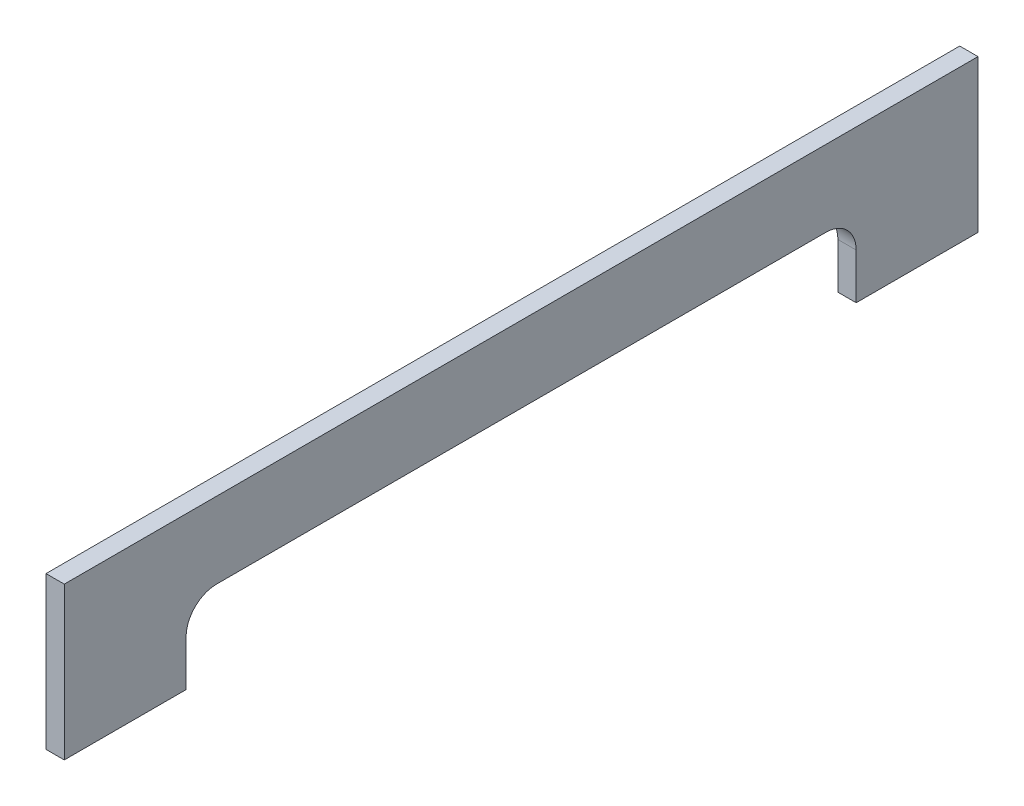
ISO-10303-21;
HEADER;
FILE_DESCRIPTION(('STEP AP214'),'2;1');
FILE_NAME('part.step','',(''),(''),'','','');
FILE_SCHEMA(('AUTOMOTIVE_DESIGN { 1 0 10303 214 1 1 1 1 }'));
ENDSEC;
DATA;
#1=APPLICATION_CONTEXT('core data for automotive mechanical design processes');
#2=APPLICATION_PROTOCOL_DEFINITION('international standard','automotive_design',2000,#1);
#3=PRODUCT_CONTEXT('',#1,'mechanical');
#4=PRODUCT('Part','Part','',(#3));
#5=PRODUCT_RELATED_PRODUCT_CATEGORY('part','',(#4));
#6=PRODUCT_DEFINITION_FORMATION('','',#4);
#7=PRODUCT_DEFINITION_CONTEXT('part definition',#1,'design');
#8=PRODUCT_DEFINITION('design','',#6,#7);
#9=PRODUCT_DEFINITION_SHAPE('','',#8);
#10=(LENGTH_UNIT() NAMED_UNIT(*) SI_UNIT(.MILLI.,.METRE.));
#11=(NAMED_UNIT(*) PLANE_ANGLE_UNIT() SI_UNIT($,.RADIAN.));
#12=(NAMED_UNIT(*) SI_UNIT($,.STERADIAN.) SOLID_ANGLE_UNIT());
#13=UNCERTAINTY_MEASURE_WITH_UNIT(LENGTH_MEASURE(1.E-05),#10,'distance_accuracy_value','');
#14=(GEOMETRIC_REPRESENTATION_CONTEXT(3) GLOBAL_UNCERTAINTY_ASSIGNED_CONTEXT((#13)) GLOBAL_UNIT_ASSIGNED_CONTEXT((#10,
#11,#12)) REPRESENTATION_CONTEXT('',''));
#15=CARTESIAN_POINT('',(0.,0.,0.));
#16=DIRECTION('',(0.,0.,1.));
#17=DIRECTION('',(1.,0.,0.));
#18=AXIS2_PLACEMENT_3D('',#15,#16,#17);
#19=CARTESIAN_POINT('',(6.,-25.,150.));
#20=DIRECTION('',(0.,1.,0.));
#21=DIRECTION('',(0.,0.,1.));
#22=AXIS2_PLACEMENT_3D('',#19,#20,#21);
#23=PLANE('',#22);
#24=DIRECTION('',(0.,0.,-1.));
#25=VECTOR('',#24,1.);
#26=CARTESIAN_POINT('',(0.,-25.,150.));
#27=LINE('',#26,#25);
#28=CARTESIAN_POINT('',(0.,-25.,150.));
#29=VERTEX_POINT('',#28);
#30=CARTESIAN_POINT('',(0.,-25.,110.));
#31=VERTEX_POINT('',#30);
#32=EDGE_CURVE('E122',#29,#31,#27,.T.);
#33=ORIENTED_EDGE('',*,*,#32,.T.);
#34=DIRECTION('',(1.,0.,0.));
#35=VECTOR('',#34,1.);
#36=CARTESIAN_POINT('',(-4.,-25.,110.));
#37=LINE('',#36,#35);
#38=CARTESIAN_POINT('',(6.,-25.,110.));
#39=VERTEX_POINT('',#38);
#40=EDGE_CURVE('E111',#31,#39,#37,.T.);
#41=ORIENTED_EDGE('',*,*,#40,.T.);
#42=DIRECTION('',(0.,0.,-1.));
#43=VECTOR('',#42,1.);
#44=CARTESIAN_POINT('',(6.,-25.,150.));
#45=LINE('',#44,#43);
#46=CARTESIAN_POINT('',(6.,-25.,150.));
#47=VERTEX_POINT('',#46);
#48=EDGE_CURVE('E120',#47,#39,#45,.T.);
#49=ORIENTED_EDGE('',*,*,#48,.F.);
#50=DIRECTION('',(-1.,0.,0.));
#51=VECTOR('',#50,1.);
#52=CARTESIAN_POINT('',(6.,-25.,150.));
#53=LINE('',#52,#51);
#54=EDGE_CURVE('E156',#47,#29,#53,.T.);
#55=ORIENTED_EDGE('',*,*,#54,.T.);
#56=EDGE_LOOP('',(#33,#41,#49,#55));
#57=FACE_BOUND('',#56,.T.);
#58=ADVANCED_FACE('F32',(#57),#23,.F.);
#59=CARTESIAN_POINT('',(6.,25.,150.));
#60=DIRECTION('',(0.,0.,-1.));
#61=DIRECTION('',(-1.,0.,0.));
#62=AXIS2_PLACEMENT_3D('',#59,#60,#61);
#63=PLANE('',#62);
#64=DIRECTION('',(0.,-1.,0.));
#65=VECTOR('',#64,1.);
#66=CARTESIAN_POINT('',(0.,25.,150.));
#67=LINE('',#66,#65);
#68=CARTESIAN_POINT('',(0.,25.,150.));
#69=VERTEX_POINT('',#68);
#70=EDGE_CURVE('E139',#69,#29,#67,.T.);
#71=ORIENTED_EDGE('',*,*,#70,.T.);
#72=ORIENTED_EDGE('',*,*,#54,.F.);
#73=DIRECTION('',(0.,-1.,0.));
#74=VECTOR('',#73,1.);
#75=CARTESIAN_POINT('',(6.,25.,150.));
#76=LINE('',#75,#74);
#77=CARTESIAN_POINT('',(6.,25.,150.));
#78=VERTEX_POINT('',#77);
#79=EDGE_CURVE('E128',#78,#47,#76,.T.);
#80=ORIENTED_EDGE('',*,*,#79,.F.);
#81=DIRECTION('',(-1.,0.,0.));
#82=VECTOR('',#81,1.);
#83=CARTESIAN_POINT('',(6.,25.,150.));
#84=LINE('',#83,#82);
#85=EDGE_CURVE('E138',#78,#69,#84,.T.);
#86=ORIENTED_EDGE('',*,*,#85,.T.);
#87=EDGE_LOOP('',(#71,#72,#80,#86));
#88=FACE_BOUND('',#87,.T.);
#89=ADVANCED_FACE('F191',(#88),#63,.F.);
#90=CARTESIAN_POINT('',(6.,-25.,-110.));
#91=VERTEX_POINT('',#90);
#92=CARTESIAN_POINT('',(6.,-25.,-150.));
#93=VERTEX_POINT('',#92);
#94=EDGE_CURVE('E131',#91,#93,#45,.T.);
#95=ORIENTED_EDGE('',*,*,#94,.F.);
#96=DIRECTION('',(1.,0.,0.));
#97=VECTOR('',#96,1.);
#98=CARTESIAN_POINT('',(-4.,-25.,-110.));
#99=LINE('',#98,#97);
#100=CARTESIAN_POINT('',(0.,-25.,-110.));
#101=VERTEX_POINT('',#100);
#102=EDGE_CURVE('E123',#101,#91,#99,.T.);
#103=ORIENTED_EDGE('',*,*,#102,.F.);
#104=CARTESIAN_POINT('',(0.,-25.,-150.));
#105=VERTEX_POINT('',#104);
#106=EDGE_CURVE('E142',#101,#105,#27,.T.);
#107=ORIENTED_EDGE('',*,*,#106,.T.);
#108=DIRECTION('',(-1.,0.,0.));
#109=VECTOR('',#108,1.);
#110=CARTESIAN_POINT('',(6.,-25.,-150.));
#111=LINE('',#110,#109);
#112=EDGE_CURVE('E153',#93,#105,#111,.T.);
#113=ORIENTED_EDGE('',*,*,#112,.F.);
#114=EDGE_LOOP('',(#95,#103,#107,#113));
#115=FACE_BOUND('',#114,.T.);
#116=ADVANCED_FACE('F193',(#115),#23,.F.);
#117=CARTESIAN_POINT('',(6.,25.,-150.));
#118=DIRECTION('',(0.,0.,1.));
#119=DIRECTION('',(1.,0.,0.));
#120=AXIS2_PLACEMENT_3D('',#117,#118,#119);
#121=PLANE('',#120);
#122=DIRECTION('',(0.,1.,0.));
#123=VECTOR('',#122,1.);
#124=CARTESIAN_POINT('',(0.,25.,-150.));
#125=LINE('',#124,#123);
#126=CARTESIAN_POINT('',(0.,25.,-150.));
#127=VERTEX_POINT('',#126);
#128=EDGE_CURVE('E144',#105,#127,#125,.T.);
#129=ORIENTED_EDGE('',*,*,#128,.T.);
#130=DIRECTION('',(-1.,0.,0.));
#131=VECTOR('',#130,1.);
#132=CARTESIAN_POINT('',(6.,25.,-150.));
#133=LINE('',#132,#131);
#134=CARTESIAN_POINT('',(6.,25.,-150.));
#135=VERTEX_POINT('',#134);
#136=EDGE_CURVE('E150',#135,#127,#133,.T.);
#137=ORIENTED_EDGE('',*,*,#136,.F.);
#138=DIRECTION('',(0.,1.,0.));
#139=VECTOR('',#138,1.);
#140=CARTESIAN_POINT('',(6.,25.,-150.));
#141=LINE('',#140,#139);
#142=EDGE_CURVE('E130',#93,#135,#141,.T.);
#143=ORIENTED_EDGE('',*,*,#142,.F.);
#144=ORIENTED_EDGE('',*,*,#112,.T.);
#145=EDGE_LOOP('',(#129,#137,#143,#144));
#146=FACE_BOUND('',#145,.T.);
#147=ADVANCED_FACE('F202',(#146),#121,.F.);
#148=CARTESIAN_POINT('',(6.,25.,150.));
#149=DIRECTION('',(0.,-1.,0.));
#150=DIRECTION('',(0.,0.,-1.));
#151=AXIS2_PLACEMENT_3D('',#148,#149,#150);
#152=PLANE('',#151);
#153=DIRECTION('',(0.,0.,1.));
#154=VECTOR('',#153,1.);
#155=CARTESIAN_POINT('',(0.,25.,150.));
#156=LINE('',#155,#154);
#157=EDGE_CURVE('E146',#127,#69,#156,.T.);
#158=ORIENTED_EDGE('',*,*,#157,.T.);
#159=ORIENTED_EDGE('',*,*,#85,.F.);
#160=DIRECTION('',(0.,0.,1.));
#161=VECTOR('',#160,1.);
#162=CARTESIAN_POINT('',(6.,25.,150.));
#163=LINE('',#162,#161);
#164=EDGE_CURVE('E133',#135,#78,#163,.T.);
#165=ORIENTED_EDGE('',*,*,#164,.F.);
#166=ORIENTED_EDGE('',*,*,#136,.T.);
#167=EDGE_LOOP('',(#158,#159,#165,#166));
#168=FACE_BOUND('',#167,.T.);
#169=ADVANCED_FACE('F208',(#168),#152,.F.);
#170=CARTESIAN_POINT('',(6.,0.,0.));
#171=DIRECTION('',(1.,0.,0.));
#172=DIRECTION('',(0.,0.,-1.));
#173=AXIS2_PLACEMENT_3D('',#170,#171,#172);
#174=PLANE('',#173);
#175=DIRECTION('',(0.,-1.,0.));
#176=VECTOR('',#175,1.);
#177=CARTESIAN_POINT('',(6.,0.,110.));
#178=LINE('',#177,#176);
#179=CARTESIAN_POINT('',(6.,-10.,110.));
#180=VERTEX_POINT('',#179);
#181=EDGE_CURVE('E108',#180,#39,#178,.T.);
#182=ORIENTED_EDGE('',*,*,#181,.F.);
#183=CARTESIAN_POINT('',(6.,-10.,100.));
#184=DIRECTION('',(1.,0.,0.));
#185=DIRECTION('',(0.,0.,-1.));
#186=AXIS2_PLACEMENT_3D('',#183,#184,#185);
#187=CIRCLE('',#186,10.);
#188=CARTESIAN_POINT('',(6.,0.,100.));
#189=VERTEX_POINT('',#188);
#190=EDGE_CURVE('E40',#180,#189,#187,.F.);
#191=ORIENTED_EDGE('',*,*,#190,.T.);
#192=DIRECTION('',(0.,0.,1.));
#193=VECTOR('',#192,1.);
#194=CARTESIAN_POINT('',(6.,0.,110.));
#195=LINE('',#194,#193);
#196=CARTESIAN_POINT('',(6.,0.,-100.));
#197=VERTEX_POINT('',#196);
#198=EDGE_CURVE('E124',#197,#189,#195,.T.);
#199=ORIENTED_EDGE('',*,*,#198,.F.);
#200=CARTESIAN_POINT('',(6.,-10.,-100.));
#201=DIRECTION('',(1.,0.,0.));
#202=DIRECTION('',(0.,0.,-1.));
#203=AXIS2_PLACEMENT_3D('',#200,#201,#202);
#204=CIRCLE('',#203,10.);
#205=CARTESIAN_POINT('',(6.,-9.99999999999999,-110.));
#206=VERTEX_POINT('',#205);
#207=EDGE_CURVE('E173',#197,#206,#204,.F.);
#208=ORIENTED_EDGE('',*,*,#207,.T.);
#209=DIRECTION('',(0.,1.,0.));
#210=VECTOR('',#209,1.);
#211=CARTESIAN_POINT('',(6.,0.,-110.));
#212=LINE('',#211,#210);
#213=EDGE_CURVE('E116',#91,#206,#212,.T.);
#214=ORIENTED_EDGE('',*,*,#213,.F.);
#215=ORIENTED_EDGE('',*,*,#94,.T.);
#216=ORIENTED_EDGE('',*,*,#142,.T.);
#217=ORIENTED_EDGE('',*,*,#164,.T.);
#218=ORIENTED_EDGE('',*,*,#79,.T.);
#219=ORIENTED_EDGE('',*,*,#48,.T.);
#220=EDGE_LOOP('',(#182,#191,#199,#208,#214,#215,#216,#217,#218,#219));
#221=FACE_BOUND('',#220,.T.);
#222=ADVANCED_FACE('F126',(#221),#174,.T.);
#223=CARTESIAN_POINT('',(0.,0.,0.));
#224=DIRECTION('',(1.,0.,0.));
#225=DIRECTION('',(0.,0.,-1.));
#226=AXIS2_PLACEMENT_3D('',#223,#224,#225);
#227=PLANE('',#226);
#228=DIRECTION('',(0.,1.,0.));
#229=VECTOR('',#228,1.);
#230=CARTESIAN_POINT('',(0.,1.22124532708767E-13,-110.));
#231=LINE('',#230,#229);
#232=CARTESIAN_POINT('',(0.,-9.99999999999999,-110.));
#233=VERTEX_POINT('',#232);
#234=EDGE_CURVE('E158',#101,#233,#231,.T.);
#235=ORIENTED_EDGE('',*,*,#234,.T.);
#236=CARTESIAN_POINT('',(0.,-10.,-100.));
#237=DIRECTION('',(1.,0.,0.));
#238=DIRECTION('',(0.,0.,-1.));
#239=AXIS2_PLACEMENT_3D('',#236,#237,#238);
#240=CIRCLE('',#239,10.);
#241=CARTESIAN_POINT('',(0.,0.,-100.));
#242=VERTEX_POINT('',#241);
#243=EDGE_CURVE('E175',#233,#242,#240,.T.);
#244=ORIENTED_EDGE('',*,*,#243,.T.);
#245=DIRECTION('',(0.,0.,1.));
#246=VECTOR('',#245,1.);
#247=CARTESIAN_POINT('',(0.,0.,0.));
#248=LINE('',#247,#246);
#249=CARTESIAN_POINT('',(0.,0.,100.));
#250=VERTEX_POINT('',#249);
#251=EDGE_CURVE('E161',#242,#250,#248,.T.);
#252=ORIENTED_EDGE('',*,*,#251,.T.);
#253=CARTESIAN_POINT('',(0.,-10.,100.));
#254=DIRECTION('',(1.,0.,0.));
#255=DIRECTION('',(0.,0.,-1.));
#256=AXIS2_PLACEMENT_3D('',#253,#254,#255);
#257=CIRCLE('',#256,10.);
#258=CARTESIAN_POINT('',(0.,-10.,110.));
#259=VERTEX_POINT('',#258);
#260=EDGE_CURVE('E11',#250,#259,#257,.T.);
#261=ORIENTED_EDGE('',*,*,#260,.T.);
#262=DIRECTION('',(0.,-1.,0.));
#263=VECTOR('',#262,1.);
#264=CARTESIAN_POINT('',(0.,0.,110.));
#265=LINE('',#264,#263);
#266=EDGE_CURVE('E163',#259,#31,#265,.T.);
#267=ORIENTED_EDGE('',*,*,#266,.T.);
#268=ORIENTED_EDGE('',*,*,#32,.F.);
#269=ORIENTED_EDGE('',*,*,#70,.F.);
#270=ORIENTED_EDGE('',*,*,#157,.F.);
#271=ORIENTED_EDGE('',*,*,#128,.F.);
#272=ORIENTED_EDGE('',*,*,#106,.F.);
#273=EDGE_LOOP('',(#235,#244,#252,#261,#267,#268,#269,#270,#271,#272));
#274=FACE_BOUND('',#273,.T.);
#275=ADVANCED_FACE('F223',(#274),#227,.F.);
#276=CARTESIAN_POINT('',(-4.,0.,110.));
#277=DIRECTION('',(0.,0.,1.));
#278=DIRECTION('',(1.,0.,0.));
#279=AXIS2_PLACEMENT_3D('',#276,#277,#278);
#280=PLANE('',#279);
#281=ORIENTED_EDGE('',*,*,#266,.F.);
#282=DIRECTION('',(1.,0.,0.));
#283=VECTOR('',#282,1.);
#284=CARTESIAN_POINT('',(6.,-10.,110.));
#285=LINE('',#284,#283);
#286=EDGE_CURVE('E113',#259,#180,#285,.T.);
#287=ORIENTED_EDGE('',*,*,#286,.T.);
#288=ORIENTED_EDGE('',*,*,#181,.T.);
#289=ORIENTED_EDGE('',*,*,#40,.F.);
#290=EDGE_LOOP('',(#281,#287,#288,#289));
#291=FACE_BOUND('',#290,.T.);
#292=ADVANCED_FACE('F110',(#291),#280,.F.);
#293=CARTESIAN_POINT('',(-4.,0.,110.));
#294=DIRECTION('',(0.,1.,0.));
#295=DIRECTION('',(0.,0.,1.));
#296=AXIS2_PLACEMENT_3D('',#293,#294,#295);
#297=PLANE('',#296);
#298=ORIENTED_EDGE('',*,*,#251,.F.);
#299=DIRECTION('',(1.,0.,0.));
#300=VECTOR('',#299,1.);
#301=CARTESIAN_POINT('',(6.,0.,-100.));
#302=LINE('',#301,#300);
#303=EDGE_CURVE('E167',#242,#197,#302,.T.);
#304=ORIENTED_EDGE('',*,*,#303,.T.);
#305=ORIENTED_EDGE('',*,*,#198,.T.);
#306=DIRECTION('',(1.,0.,0.));
#307=VECTOR('',#306,1.);
#308=CARTESIAN_POINT('',(0.,0.,100.));
#309=LINE('',#308,#307);
#310=EDGE_CURVE('E165',#189,#250,#309,.F.);
#311=ORIENTED_EDGE('',*,*,#310,.T.);
#312=EDGE_LOOP('',(#298,#304,#305,#311));
#313=FACE_BOUND('',#312,.T.);
#314=ADVANCED_FACE('F180',(#313),#297,.F.);
#315=CARTESIAN_POINT('',(-4.,0.,-110.));
#316=DIRECTION('',(0.,0.,-1.));
#317=DIRECTION('',(0.,1.,0.));
#318=AXIS2_PLACEMENT_3D('',#315,#316,#317);
#319=PLANE('',#318);
#320=ORIENTED_EDGE('',*,*,#213,.T.);
#321=DIRECTION('',(1.,0.,0.));
#322=VECTOR('',#321,1.);
#323=CARTESIAN_POINT('',(0.,-9.99999999999999,-110.));
#324=LINE('',#323,#322);
#325=EDGE_CURVE('E170',#206,#233,#324,.F.);
#326=ORIENTED_EDGE('',*,*,#325,.T.);
#327=ORIENTED_EDGE('',*,*,#234,.F.);
#328=ORIENTED_EDGE('',*,*,#102,.T.);
#329=EDGE_LOOP('',(#320,#326,#327,#328));
#330=FACE_BOUND('',#329,.T.);
#331=ADVANCED_FACE('F188',(#330),#319,.F.);
#332=CARTESIAN_POINT('',(-4.,-10.,-100.));
#333=DIRECTION('',(-1.,0.,0.));
#334=DIRECTION('',(0.,0.,1.));
#335=AXIS2_PLACEMENT_3D('',#332,#333,#334);
#336=CYLINDRICAL_SURFACE('',#335,10.);
#337=ORIENTED_EDGE('',*,*,#243,.F.);
#338=ORIENTED_EDGE('',*,*,#325,.F.);
#339=ORIENTED_EDGE('',*,*,#207,.F.);
#340=ORIENTED_EDGE('',*,*,#303,.F.);
#341=EDGE_LOOP('',(#337,#338,#339,#340));
#342=FACE_BOUND('',#341,.T.);
#343=ADVANCED_FACE('F184',(#342),#336,.F.);
#344=CARTESIAN_POINT('',(-4.,-10.,100.));
#345=DIRECTION('',(-1.,0.,0.));
#346=DIRECTION('',(0.,0.,1.));
#347=AXIS2_PLACEMENT_3D('',#344,#345,#346);
#348=CYLINDRICAL_SURFACE('',#347,10.);
#349=ORIENTED_EDGE('',*,*,#260,.F.);
#350=ORIENTED_EDGE('',*,*,#310,.F.);
#351=ORIENTED_EDGE('',*,*,#190,.F.);
#352=ORIENTED_EDGE('',*,*,#286,.F.);
#353=EDGE_LOOP('',(#349,#350,#351,#352));
#354=FACE_BOUND('',#353,.T.);
#355=ADVANCED_FACE('F34',(#354),#348,.F.);
#356=CLOSED_SHELL('',(#58,#89,#116,#147,#169,#222,#275,#292,#314,#331,#343,#355));
#357=MANIFOLD_SOLID_BREP('B2',#356);
#358=ADVANCED_BREP_SHAPE_REPRESENTATION('',(#18,#357),#14);
#359=SHAPE_DEFINITION_REPRESENTATION(#9,#358);
ENDSEC;
END-ISO-10303-21;
